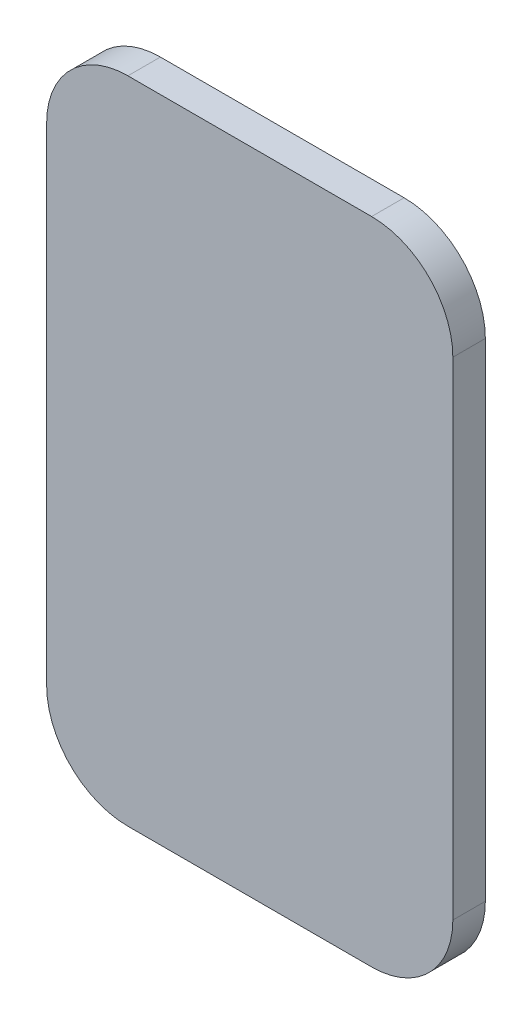
ISO-10303-21;
HEADER;
FILE_DESCRIPTION(('STEP AP214'),'2;1');
FILE_NAME('part.step','',(''),(''),'','','');
FILE_SCHEMA(('AUTOMOTIVE_DESIGN { 1 0 10303 214 1 1 1 1 }'));
ENDSEC;
DATA;
#1=APPLICATION_CONTEXT('core data for automotive mechanical design processes');
#2=APPLICATION_PROTOCOL_DEFINITION('international standard','automotive_design',2000,#1);
#3=PRODUCT_CONTEXT('',#1,'mechanical');
#4=PRODUCT('Part','Part','',(#3));
#5=PRODUCT_RELATED_PRODUCT_CATEGORY('part','',(#4));
#6=PRODUCT_DEFINITION_FORMATION('','',#4);
#7=PRODUCT_DEFINITION_CONTEXT('part definition',#1,'design');
#8=PRODUCT_DEFINITION('design','',#6,#7);
#9=PRODUCT_DEFINITION_SHAPE('','',#8);
#10=(LENGTH_UNIT() NAMED_UNIT(*) SI_UNIT(.MILLI.,.METRE.));
#11=(NAMED_UNIT(*) PLANE_ANGLE_UNIT() SI_UNIT($,.RADIAN.));
#12=(NAMED_UNIT(*) SI_UNIT($,.STERADIAN.) SOLID_ANGLE_UNIT());
#13=UNCERTAINTY_MEASURE_WITH_UNIT(LENGTH_MEASURE(1.E-05),#10,'distance_accuracy_value','');
#14=(GEOMETRIC_REPRESENTATION_CONTEXT(3) GLOBAL_UNCERTAINTY_ASSIGNED_CONTEXT((#13)) GLOBAL_UNIT_ASSIGNED_CONTEXT((#10,
#11,#12)) REPRESENTATION_CONTEXT('',''));
#15=CARTESIAN_POINT('',(0.,0.,0.));
#16=DIRECTION('',(0.,0.,1.));
#17=DIRECTION('',(1.,0.,0.));
#18=AXIS2_PLACEMENT_3D('',#15,#16,#17);
#19=CARTESIAN_POINT('',(-21.083176362362,7.83173076923077,2.));
#20=DIRECTION('',(0.,0.,-1.));
#21=DIRECTION('',(-1.,0.,0.));
#22=AXIS2_PLACEMENT_3D('',#19,#20,#21);
#23=CYLINDRICAL_SURFACE('',#22,5.);
#24=CARTESIAN_POINT('',(-21.083176362362,7.83173076923077,0.));
#25=DIRECTION('',(0.,0.,1.));
#26=DIRECTION('',(-1.,0.,0.));
#27=AXIS2_PLACEMENT_3D('',#24,#25,#26);
#28=CIRCLE('',#27,5.);
#29=CARTESIAN_POINT('',(-26.083176362362,7.83173076923081,0.));
#30=VERTEX_POINT('',#29);
#31=CARTESIAN_POINT('',(-21.083176362362,2.83173076923078,0.));
#32=VERTEX_POINT('',#31);
#33=EDGE_CURVE('E148',#30,#32,#28,.T.);
#34=ORIENTED_EDGE('',*,*,#33,.T.);
#35=DIRECTION('',(0.,0.,-1.));
#36=VECTOR('',#35,1.);
#37=CARTESIAN_POINT('',(-21.083176362362,2.83173076923078,2.));
#38=LINE('',#37,#36);
#39=CARTESIAN_POINT('',(-21.083176362362,2.83173076923078,2.));
#40=VERTEX_POINT('',#39);
#41=EDGE_CURVE('E11',#40,#32,#38,.T.);
#42=ORIENTED_EDGE('',*,*,#41,.F.);
#43=CARTESIAN_POINT('',(-21.083176362362,7.83173076923077,2.));
#44=DIRECTION('',(0.,0.,1.));
#45=DIRECTION('',(-1.,0.,0.));
#46=AXIS2_PLACEMENT_3D('',#43,#44,#45);
#47=CIRCLE('',#46,5.);
#48=CARTESIAN_POINT('',(-26.083176362362,7.83173076923081,2.));
#49=VERTEX_POINT('',#48);
#50=EDGE_CURVE('E170',#49,#40,#47,.T.);
#51=ORIENTED_EDGE('',*,*,#50,.F.);
#52=DIRECTION('',(0.,0.,-1.));
#53=VECTOR('',#52,1.);
#54=CARTESIAN_POINT('',(-26.083176362362,7.83173076923081,2.));
#55=LINE('',#54,#53);
#56=EDGE_CURVE('E144',#49,#30,#55,.T.);
#57=ORIENTED_EDGE('',*,*,#56,.T.);
#58=EDGE_LOOP('',(#34,#42,#51,#57));
#59=FACE_BOUND('',#58,.T.);
#60=ADVANCED_FACE('F47',(#59),#23,.T.);
#61=CARTESIAN_POINT('',(-21.083176362362,2.83173076923078,2.));
#62=DIRECTION('',(0.,1.,0.));
#63=DIRECTION('',(0.,0.,1.));
#64=AXIS2_PLACEMENT_3D('',#61,#62,#63);
#65=PLANE('',#64);
#66=DIRECTION('',(1.,0.,0.));
#67=VECTOR('',#66,1.);
#68=CARTESIAN_POINT('',(-21.083176362362,2.83173076923078,0.));
#69=LINE('',#68,#67);
#70=CARTESIAN_POINT('',(-6.08317636236208,2.83173076923078,0.));
#71=VERTEX_POINT('',#70);
#72=EDGE_CURVE('E152',#32,#71,#69,.T.);
#73=ORIENTED_EDGE('',*,*,#72,.T.);
#74=DIRECTION('',(0.,0.,-1.));
#75=VECTOR('',#74,1.);
#76=CARTESIAN_POINT('',(-6.08317636236208,2.83173076923078,2.));
#77=LINE('',#76,#75);
#78=CARTESIAN_POINT('',(-6.08317636236208,2.83173076923078,2.));
#79=VERTEX_POINT('',#78);
#80=EDGE_CURVE('E56',#79,#71,#77,.T.);
#81=ORIENTED_EDGE('',*,*,#80,.F.);
#82=DIRECTION('',(1.,0.,0.));
#83=VECTOR('',#82,1.);
#84=CARTESIAN_POINT('',(-21.083176362362,2.83173076923078,2.));
#85=LINE('',#84,#83);
#86=EDGE_CURVE('E107',#40,#79,#85,.T.);
#87=ORIENTED_EDGE('',*,*,#86,.F.);
#88=ORIENTED_EDGE('',*,*,#41,.T.);
#89=EDGE_LOOP('',(#73,#81,#87,#88));
#90=FACE_BOUND('',#89,.T.);
#91=ADVANCED_FACE('F216',(#90),#65,.F.);
#92=CARTESIAN_POINT('',(-6.08317636236204,7.83173076923077,2.));
#93=DIRECTION('',(0.,0.,-1.));
#94=DIRECTION('',(-1.,0.,0.));
#95=AXIS2_PLACEMENT_3D('',#92,#93,#94);
#96=CYLINDRICAL_SURFACE('',#95,5.);
#97=CARTESIAN_POINT('',(-6.08317636236204,7.83173076923077,0.));
#98=DIRECTION('',(0.,0.,1.));
#99=DIRECTION('',(-1.,0.,0.));
#100=AXIS2_PLACEMENT_3D('',#97,#98,#99);
#101=CIRCLE('',#100,5.);
#102=CARTESIAN_POINT('',(-1.08317636236204,7.83173076923081,0.));
#103=VERTEX_POINT('',#102);
#104=EDGE_CURVE('E155',#71,#103,#101,.T.);
#105=ORIENTED_EDGE('',*,*,#104,.T.);
#106=DIRECTION('',(0.,0.,-1.));
#107=VECTOR('',#106,1.);
#108=CARTESIAN_POINT('',(-1.08317636236204,7.83173076923081,2.));
#109=LINE('',#108,#107);
#110=CARTESIAN_POINT('',(-1.08317636236204,7.83173076923081,2.));
#111=VERTEX_POINT('',#110);
#112=EDGE_CURVE('E181',#111,#103,#109,.T.);
#113=ORIENTED_EDGE('',*,*,#112,.F.);
#114=CARTESIAN_POINT('',(-6.08317636236204,7.83173076923077,2.));
#115=DIRECTION('',(0.,0.,1.));
#116=DIRECTION('',(-1.,0.,0.));
#117=AXIS2_PLACEMENT_3D('',#114,#115,#116);
#118=CIRCLE('',#117,5.);
#119=EDGE_CURVE('E191',#79,#111,#118,.T.);
#120=ORIENTED_EDGE('',*,*,#119,.F.);
#121=ORIENTED_EDGE('',*,*,#80,.T.);
#122=EDGE_LOOP('',(#105,#113,#120,#121));
#123=FACE_BOUND('',#122,.T.);
#124=ADVANCED_FACE('F189',(#123),#96,.T.);
#125=CARTESIAN_POINT('',(-1.08317636236205,37.8317307692307,2.));
#126=DIRECTION('',(-1.,0.,0.));
#127=DIRECTION('',(0.,-1.,0.));
#128=AXIS2_PLACEMENT_3D('',#125,#126,#127);
#129=PLANE('',#128);
#130=DIRECTION('',(0.,1.,0.));
#131=VECTOR('',#130,1.);
#132=CARTESIAN_POINT('',(-1.08317636236205,37.8317307692307,0.));
#133=LINE('',#132,#131);
#134=CARTESIAN_POINT('',(-1.08317636236205,37.8317307692307,0.));
#135=VERTEX_POINT('',#134);
#136=EDGE_CURVE('E158',#103,#135,#133,.T.);
#137=ORIENTED_EDGE('',*,*,#136,.T.);
#138=DIRECTION('',(0.,0.,-1.));
#139=VECTOR('',#138,1.);
#140=CARTESIAN_POINT('',(-1.08317636236205,37.8317307692307,2.));
#141=LINE('',#140,#139);
#142=CARTESIAN_POINT('',(-1.08317636236205,37.8317307692307,2.));
#143=VERTEX_POINT('',#142);
#144=EDGE_CURVE('E177',#143,#135,#141,.T.);
#145=ORIENTED_EDGE('',*,*,#144,.F.);
#146=DIRECTION('',(0.,1.,0.));
#147=VECTOR('',#146,1.);
#148=CARTESIAN_POINT('',(-1.08317636236205,37.8317307692307,2.));
#149=LINE('',#148,#147);
#150=EDGE_CURVE('E204',#111,#143,#149,.T.);
#151=ORIENTED_EDGE('',*,*,#150,.F.);
#152=ORIENTED_EDGE('',*,*,#112,.T.);
#153=EDGE_LOOP('',(#137,#145,#151,#152));
#154=FACE_BOUND('',#153,.T.);
#155=ADVANCED_FACE('F199',(#154),#129,.F.);
#156=CARTESIAN_POINT('',(-6.08317636236205,37.8317307692308,2.));
#157=DIRECTION('',(0.,0.,-1.));
#158=DIRECTION('',(-1.,0.,0.));
#159=AXIS2_PLACEMENT_3D('',#156,#157,#158);
#160=CYLINDRICAL_SURFACE('',#159,5.);
#161=CARTESIAN_POINT('',(-6.08317636236205,37.8317307692308,0.));
#162=DIRECTION('',(0.,0.,1.));
#163=DIRECTION('',(1.,0.,0.));
#164=AXIS2_PLACEMENT_3D('',#161,#162,#163);
#165=CIRCLE('',#164,5.);
#166=CARTESIAN_POINT('',(-6.08317636236208,42.8317307692308,0.));
#167=VERTEX_POINT('',#166);
#168=EDGE_CURVE('E161',#135,#167,#165,.T.);
#169=ORIENTED_EDGE('',*,*,#168,.T.);
#170=DIRECTION('',(0.,0.,-1.));
#171=VECTOR('',#170,1.);
#172=CARTESIAN_POINT('',(-6.08317636236208,42.8317307692308,2.));
#173=LINE('',#172,#171);
#174=CARTESIAN_POINT('',(-6.08317636236208,42.8317307692308,2.));
#175=VERTEX_POINT('',#174);
#176=EDGE_CURVE('E137',#175,#167,#173,.T.);
#177=ORIENTED_EDGE('',*,*,#176,.F.);
#178=CARTESIAN_POINT('',(-6.08317636236205,37.8317307692308,2.));
#179=DIRECTION('',(0.,0.,1.));
#180=DIRECTION('',(1.,0.,0.));
#181=AXIS2_PLACEMENT_3D('',#178,#179,#180);
#182=CIRCLE('',#181,5.);
#183=EDGE_CURVE('E126',#143,#175,#182,.T.);
#184=ORIENTED_EDGE('',*,*,#183,.F.);
#185=ORIENTED_EDGE('',*,*,#144,.T.);
#186=EDGE_LOOP('',(#169,#177,#184,#185));
#187=FACE_BOUND('',#186,.T.);
#188=ADVANCED_FACE('F202',(#187),#160,.T.);
#189=CARTESIAN_POINT('',(-21.083176362362,42.8317307692308,2.));
#190=DIRECTION('',(0.,-1.,0.));
#191=DIRECTION('',(0.,0.,-1.));
#192=AXIS2_PLACEMENT_3D('',#189,#190,#191);
#193=PLANE('',#192);
#194=DIRECTION('',(-1.,0.,0.));
#195=VECTOR('',#194,1.);
#196=CARTESIAN_POINT('',(-21.083176362362,42.8317307692308,0.));
#197=LINE('',#196,#195);
#198=CARTESIAN_POINT('',(-21.083176362362,42.8317307692308,0.));
#199=VERTEX_POINT('',#198);
#200=EDGE_CURVE('E135',#167,#199,#197,.T.);
#201=ORIENTED_EDGE('',*,*,#200,.T.);
#202=DIRECTION('',(0.,0.,-1.));
#203=VECTOR('',#202,1.);
#204=CARTESIAN_POINT('',(-21.083176362362,42.8317307692308,2.));
#205=LINE('',#204,#203);
#206=CARTESIAN_POINT('',(-21.083176362362,42.8317307692308,2.));
#207=VERTEX_POINT('',#206);
#208=EDGE_CURVE('E132',#207,#199,#205,.T.);
#209=ORIENTED_EDGE('',*,*,#208,.F.);
#210=DIRECTION('',(-1.,0.,0.));
#211=VECTOR('',#210,1.);
#212=CARTESIAN_POINT('',(-21.083176362362,42.8317307692308,2.));
#213=LINE('',#212,#211);
#214=EDGE_CURVE('E120',#175,#207,#213,.T.);
#215=ORIENTED_EDGE('',*,*,#214,.F.);
#216=ORIENTED_EDGE('',*,*,#176,.T.);
#217=EDGE_LOOP('',(#201,#209,#215,#216));
#218=FACE_BOUND('',#217,.T.);
#219=ADVANCED_FACE('F133',(#218),#193,.F.);
#220=CARTESIAN_POINT('',(-21.083176362362,37.8317307692308,2.));
#221=DIRECTION('',(0.,0.,-1.));
#222=DIRECTION('',(-1.,0.,0.));
#223=AXIS2_PLACEMENT_3D('',#220,#221,#222);
#224=CYLINDRICAL_SURFACE('',#223,5.);
#225=CARTESIAN_POINT('',(-21.083176362362,37.8317307692308,0.));
#226=DIRECTION('',(0.,0.,1.));
#227=DIRECTION('',(1.,0.,0.));
#228=AXIS2_PLACEMENT_3D('',#225,#226,#227);
#229=CIRCLE('',#228,5.);
#230=CARTESIAN_POINT('',(-26.083176362362,37.8317307692307,0.));
#231=VERTEX_POINT('',#230);
#232=EDGE_CURVE('E93',#199,#231,#229,.T.);
#233=ORIENTED_EDGE('',*,*,#232,.T.);
#234=DIRECTION('',(0.,0.,-1.));
#235=VECTOR('',#234,1.);
#236=CARTESIAN_POINT('',(-26.083176362362,37.8317307692307,2.));
#237=LINE('',#236,#235);
#238=CARTESIAN_POINT('',(-26.083176362362,37.8317307692307,2.));
#239=VERTEX_POINT('',#238);
#240=EDGE_CURVE('E138',#239,#231,#237,.T.);
#241=ORIENTED_EDGE('',*,*,#240,.F.);
#242=CARTESIAN_POINT('',(-21.083176362362,37.8317307692308,2.));
#243=DIRECTION('',(0.,0.,1.));
#244=DIRECTION('',(1.,0.,0.));
#245=AXIS2_PLACEMENT_3D('',#242,#243,#244);
#246=CIRCLE('',#245,5.);
#247=EDGE_CURVE('E124',#207,#239,#246,.T.);
#248=ORIENTED_EDGE('',*,*,#247,.F.);
#249=ORIENTED_EDGE('',*,*,#208,.T.);
#250=EDGE_LOOP('',(#233,#241,#248,#249));
#251=FACE_BOUND('',#250,.T.);
#252=ADVANCED_FACE('F140',(#251),#224,.T.);
#253=CARTESIAN_POINT('',(-26.083176362362,37.8317307692307,2.));
#254=DIRECTION('',(1.,0.,0.));
#255=DIRECTION('',(0.,0.,-1.));
#256=AXIS2_PLACEMENT_3D('',#253,#254,#255);
#257=PLANE('',#256);
#258=DIRECTION('',(0.,-1.,0.));
#259=VECTOR('',#258,1.);
#260=CARTESIAN_POINT('',(-26.083176362362,37.8317307692307,0.));
#261=LINE('',#260,#259);
#262=EDGE_CURVE('E99',#231,#30,#261,.T.);
#263=ORIENTED_EDGE('',*,*,#262,.T.);
#264=ORIENTED_EDGE('',*,*,#56,.F.);
#265=DIRECTION('',(0.,-1.,0.));
#266=VECTOR('',#265,1.);
#267=CARTESIAN_POINT('',(-26.083176362362,37.8317307692307,2.));
#268=LINE('',#267,#266);
#269=EDGE_CURVE('E64',#239,#49,#268,.T.);
#270=ORIENTED_EDGE('',*,*,#269,.F.);
#271=ORIENTED_EDGE('',*,*,#240,.T.);
#272=EDGE_LOOP('',(#263,#264,#270,#271));
#273=FACE_BOUND('',#272,.T.);
#274=ADVANCED_FACE('F232',(#273),#257,.F.);
#275=CARTESIAN_POINT('',(-21.083176362362,7.83173076923077,2.));
#276=DIRECTION('',(0.,0.,-1.));
#277=DIRECTION('',(-1.,0.,0.));
#278=AXIS2_PLACEMENT_3D('',#275,#276,#277);
#279=PLANE('',#278);
#280=ORIENTED_EDGE('',*,*,#50,.T.);
#281=ORIENTED_EDGE('',*,*,#86,.T.);
#282=ORIENTED_EDGE('',*,*,#119,.T.);
#283=ORIENTED_EDGE('',*,*,#150,.T.);
#284=ORIENTED_EDGE('',*,*,#183,.T.);
#285=ORIENTED_EDGE('',*,*,#214,.T.);
#286=ORIENTED_EDGE('',*,*,#247,.T.);
#287=ORIENTED_EDGE('',*,*,#269,.T.);
#288=EDGE_LOOP('',(#280,#281,#282,#283,#284,#285,#286,#287));
#289=FACE_BOUND('',#288,.T.);
#290=ADVANCED_FACE('F122',(#289),#279,.F.);
#291=CARTESIAN_POINT('',(-21.083176362362,7.83173076923077,0.));
#292=DIRECTION('',(0.,0.,-1.));
#293=DIRECTION('',(-1.,0.,0.));
#294=AXIS2_PLACEMENT_3D('',#291,#292,#293);
#295=PLANE('',#294);
#296=ORIENTED_EDGE('',*,*,#33,.F.);
#297=ORIENTED_EDGE('',*,*,#262,.F.);
#298=ORIENTED_EDGE('',*,*,#232,.F.);
#299=ORIENTED_EDGE('',*,*,#200,.F.);
#300=ORIENTED_EDGE('',*,*,#168,.F.);
#301=ORIENTED_EDGE('',*,*,#136,.F.);
#302=ORIENTED_EDGE('',*,*,#104,.F.);
#303=ORIENTED_EDGE('',*,*,#72,.F.);
#304=EDGE_LOOP('',(#296,#297,#298,#299,#300,#301,#302,#303));
#305=FACE_BOUND('',#304,.T.);
#306=ADVANCED_FACE('F195',(#305),#295,.T.);
#307=CLOSED_SHELL('',(#60,#91,#124,#155,#188,#219,#252,#274,#290,#306));
#308=MANIFOLD_SOLID_BREP('B2',#307);
#309=ADVANCED_BREP_SHAPE_REPRESENTATION('',(#18,#308),#14);
#310=SHAPE_DEFINITION_REPRESENTATION(#9,#309);
ENDSEC;
END-ISO-10303-21;
